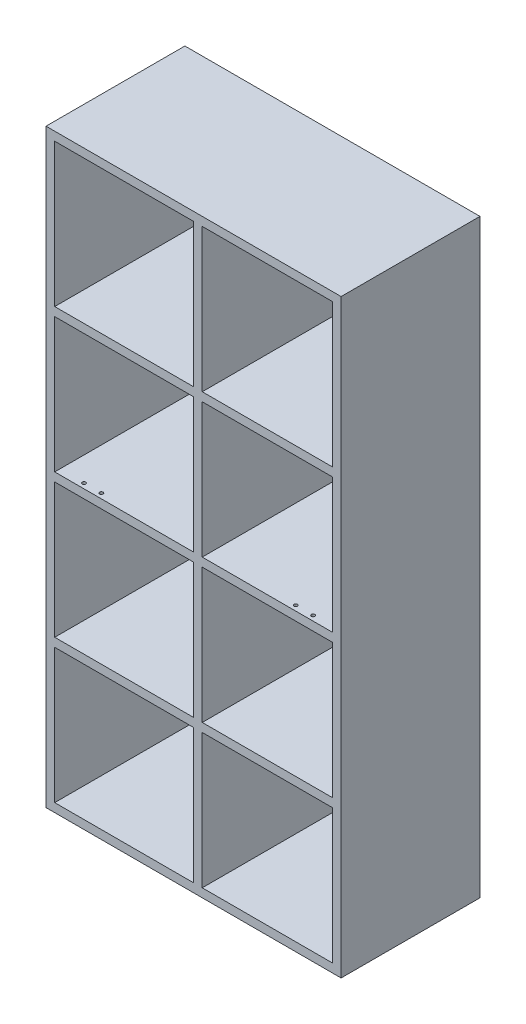
ISO-10303-21;
HEADER;
FILE_DESCRIPTION(('STEP AP214'),'2;1');
FILE_NAME('part.step','',(''),(''),'','','');
FILE_SCHEMA(('AUTOMOTIVE_DESIGN { 1 0 10303 214 1 1 1 1 }'));
ENDSEC;
DATA;
#1=APPLICATION_CONTEXT('core data for automotive mechanical design processes');
#2=APPLICATION_PROTOCOL_DEFINITION('international standard','automotive_design',2000,#1);
#3=PRODUCT_CONTEXT('',#1,'mechanical');
#4=PRODUCT('Part','Part','',(#3));
#5=PRODUCT_RELATED_PRODUCT_CATEGORY('part','',(#4));
#6=PRODUCT_DEFINITION_FORMATION('','',#4);
#7=PRODUCT_DEFINITION_CONTEXT('part definition',#1,'design');
#8=PRODUCT_DEFINITION('design','',#6,#7);
#9=PRODUCT_DEFINITION_SHAPE('','',#8);
#10=(LENGTH_UNIT() NAMED_UNIT(*) SI_UNIT(.MILLI.,.METRE.));
#11=(NAMED_UNIT(*) PLANE_ANGLE_UNIT() SI_UNIT($,.RADIAN.));
#12=(NAMED_UNIT(*) SI_UNIT($,.STERADIAN.) SOLID_ANGLE_UNIT());
#13=UNCERTAINTY_MEASURE_WITH_UNIT(LENGTH_MEASURE(1.E-05),#10,'distance_accuracy_value','');
#14=(GEOMETRIC_REPRESENTATION_CONTEXT(3) GLOBAL_UNCERTAINTY_ASSIGNED_CONTEXT((#13)) GLOBAL_UNIT_ASSIGNED_CONTEXT((#10,
#11,#12)) REPRESENTATION_CONTEXT('',''));
#15=CARTESIAN_POINT('',(0.,0.,0.));
#16=DIRECTION('',(0.,0.,1.));
#17=DIRECTION('',(1.,0.,0.));
#18=AXIS2_PLACEMENT_3D('',#15,#16,#17);
#19=CARTESIAN_POINT('',(-4.32070815681838E-12,1237.5,400.));
#20=DIRECTION('',(0.,1.,0.));
#21=DIRECTION('',(0.,0.,1.));
#22=AXIS2_PLACEMENT_3D('',#19,#20,#21);
#23=PLANE('',#22);
#24=DIRECTION('',(0.,0.,1.));
#25=VECTOR('',#24,1.);
#26=CARTESIAN_POINT('',(399.999999999996,1237.5,400.));
#27=LINE('',#26,#25);
#28=CARTESIAN_POINT('',(399.999999999996,1237.5,0.));
#29=VERTEX_POINT('',#28);
#30=CARTESIAN_POINT('',(399.999999999996,1237.5,400.));
#31=VERTEX_POINT('',#30);
#32=EDGE_CURVE('E416',#29,#31,#27,.T.);
#33=ORIENTED_EDGE('',*,*,#32,.F.);
#34=DIRECTION('',(1.,0.,0.));
#35=VECTOR('',#34,1.);
#36=CARTESIAN_POINT('',(-4.32070815681838E-12,1237.5,0.));
#37=LINE('',#36,#35);
#38=CARTESIAN_POINT('',(-4.32070815681838E-12,1237.5,0.));
#39=VERTEX_POINT('',#38);
#40=EDGE_CURVE('E456',#39,#29,#37,.T.);
#41=ORIENTED_EDGE('',*,*,#40,.F.);
#42=DIRECTION('',(0.,0.,-1.));
#43=VECTOR('',#42,1.);
#44=CARTESIAN_POINT('',(-4.32070815681838E-12,1237.5,400.));
#45=LINE('',#44,#43);
#46=CARTESIAN_POINT('',(-4.32070815681838E-12,1237.5,400.));
#47=VERTEX_POINT('',#46);
#48=EDGE_CURVE('E467',#47,#39,#45,.T.);
#49=ORIENTED_EDGE('',*,*,#48,.F.);
#50=DIRECTION('',(1.,0.,0.));
#51=VECTOR('',#50,1.);
#52=CARTESIAN_POINT('',(-4.32070815681838E-12,1237.5,400.));
#53=LINE('',#52,#51);
#54=EDGE_CURVE('E333',#47,#31,#53,.T.);
#55=ORIENTED_EDGE('',*,*,#54,.T.);
#56=EDGE_LOOP('',(#33,#41,#49,#55));
#57=FACE_BOUND('',#56,.T.);
#58=ADVANCED_FACE('F128',(#57),#23,.T.);
#59=CARTESIAN_POINT('',(-4.32070815681838E-12,1212.5,400.));
#60=DIRECTION('',(0.,1.,0.));
#61=DIRECTION('',(0.,0.,1.));
#62=AXIS2_PLACEMENT_3D('',#59,#60,#61);
#63=PLANE('',#62);
#64=DIRECTION('',(1.,0.,0.));
#65=VECTOR('',#64,1.);
#66=CARTESIAN_POINT('',(-4.32070815681838E-12,1212.5,0.));
#67=LINE('',#66,#65);
#68=CARTESIAN_POINT('',(-4.32070815681838E-12,1212.5,0.));
#69=VERTEX_POINT('',#68);
#70=CARTESIAN_POINT('',(399.999999999996,1212.5,0.));
#71=VERTEX_POINT('',#70);
#72=EDGE_CURVE('E433',#69,#71,#67,.T.);
#73=ORIENTED_EDGE('',*,*,#72,.T.);
#74=DIRECTION('',(0.,0.,1.));
#75=VECTOR('',#74,1.);
#76=CARTESIAN_POINT('',(399.999999999996,1212.5,400.));
#77=LINE('',#76,#75);
#78=CARTESIAN_POINT('',(399.999999999996,1212.5,400.));
#79=VERTEX_POINT('',#78);
#80=EDGE_CURVE('E137',#71,#79,#77,.T.);
#81=ORIENTED_EDGE('',*,*,#80,.T.);
#82=DIRECTION('',(1.,0.,0.));
#83=VECTOR('',#82,1.);
#84=CARTESIAN_POINT('',(-4.32070815681838E-12,1212.5,400.));
#85=LINE('',#84,#83);
#86=CARTESIAN_POINT('',(-4.32070815681838E-12,1212.5,400.));
#87=VERTEX_POINT('',#86);
#88=EDGE_CURVE('E430',#87,#79,#85,.T.);
#89=ORIENTED_EDGE('',*,*,#88,.F.);
#90=DIRECTION('',(0.,0.,-1.));
#91=VECTOR('',#90,1.);
#92=CARTESIAN_POINT('',(-4.32070815681838E-12,1212.5,400.));
#93=LINE('',#92,#91);
#94=EDGE_CURVE('E461',#87,#69,#93,.T.);
#95=ORIENTED_EDGE('',*,*,#94,.T.);
#96=EDGE_LOOP('',(#73,#81,#89,#95));
#97=FACE_BOUND('',#96,.T.);
#98=ADVANCED_FACE('F426',(#97),#63,.F.);
#99=CARTESIAN_POINT('',(0.,0.,0.));
#100=DIRECTION('',(0.,0.,-1.));
#101=DIRECTION('',(-1.,0.,0.));
#102=AXIS2_PLACEMENT_3D('',#99,#100,#101);
#103=PLANE('',#102);
#104=DIRECTION('',(0.,1.,0.));
#105=VECTOR('',#104,1.);
#106=CARTESIAN_POINT('',(800.,0.,0.));
#107=LINE('',#106,#105);
#108=CARTESIAN_POINT('',(800.,0.,0.));
#109=VERTEX_POINT('',#108);
#110=CARTESIAN_POINT('',(799.999999999999,387.5,0.));
#111=VERTEX_POINT('',#110);
#112=EDGE_CURVE('E562',#109,#111,#107,.T.);
#113=ORIENTED_EDGE('',*,*,#112,.T.);
#114=DIRECTION('',(1.,0.,0.));
#115=VECTOR('',#114,1.);
#116=CARTESIAN_POINT('',(-1.44023605227279E-12,387.5,0.));
#117=LINE('',#116,#115);
#118=CARTESIAN_POINT('',(424.999999999999,387.5,0.));
#119=VERTEX_POINT('',#118);
#120=EDGE_CURVE('E397',#119,#111,#117,.T.);
#121=ORIENTED_EDGE('',*,*,#120,.F.);
#122=DIRECTION('',(0.,1.,0.));
#123=VECTOR('',#122,1.);
#124=CARTESIAN_POINT('',(425.,0.,0.));
#125=LINE('',#124,#123);
#126=CARTESIAN_POINT('',(425.,0.,0.));
#127=VERTEX_POINT('',#126);
#128=EDGE_CURVE('E482',#127,#119,#125,.T.);
#129=ORIENTED_EDGE('',*,*,#128,.F.);
#130=DIRECTION('',(1.,0.,0.));
#131=VECTOR('',#130,1.);
#132=CARTESIAN_POINT('',(0.,0.,0.));
#133=LINE('',#132,#131);
#134=EDGE_CURVE('E561',#127,#109,#133,.T.);
#135=ORIENTED_EDGE('',*,*,#134,.T.);
#136=EDGE_LOOP('',(#113,#121,#129,#135));
#137=FACE_BOUND('',#136,.T.);
#138=DIRECTION('',(0.,1.,0.));
#139=VECTOR('',#138,1.);
#140=CARTESIAN_POINT('',(0.,0.,0.));
#141=LINE('',#140,#139);
#142=CARTESIAN_POINT('',(-1.44023605227279E-12,412.5,0.));
#143=VERTEX_POINT('',#142);
#144=CARTESIAN_POINT('',(-2.88047210454559E-12,800.,0.));
#145=VERTEX_POINT('',#144);
#146=EDGE_CURVE('E570',#143,#145,#141,.T.);
#147=ORIENTED_EDGE('',*,*,#146,.F.);
#148=DIRECTION('',(1.,0.,0.));
#149=VECTOR('',#148,1.);
#150=CARTESIAN_POINT('',(-1.44023605227279E-12,412.5,0.));
#151=LINE('',#150,#149);
#152=CARTESIAN_POINT('',(399.999999999999,412.5,0.));
#153=VERTEX_POINT('',#152);
#154=EDGE_CURVE('E536',#143,#153,#151,.T.);
#155=ORIENTED_EDGE('',*,*,#154,.T.);
#156=DIRECTION('',(0.,1.,0.));
#157=VECTOR('',#156,1.);
#158=CARTESIAN_POINT('',(400.,0.,0.));
#159=LINE('',#158,#157);
#160=CARTESIAN_POINT('',(399.999999999997,800.,0.));
#161=VERTEX_POINT('',#160);
#162=EDGE_CURVE('E491',#153,#161,#159,.T.);
#163=ORIENTED_EDGE('',*,*,#162,.T.);
#164=DIRECTION('',(1.,0.,0.));
#165=VECTOR('',#164,1.);
#166=CARTESIAN_POINT('',(-2.88047210454559E-12,800.,0.));
#167=LINE('',#166,#165);
#168=EDGE_CURVE('E506',#145,#161,#167,.T.);
#169=ORIENTED_EDGE('',*,*,#168,.F.);
#170=EDGE_LOOP('',(#147,#155,#163,#169));
#171=FACE_BOUND('',#170,.T.);
#172=CARTESIAN_POINT('',(799.999999999999,412.5,0.));
#173=VERTEX_POINT('',#172);
#174=CARTESIAN_POINT('',(799.999999999997,800.,0.));
#175=VERTEX_POINT('',#174);
#176=EDGE_CURVE('E566',#173,#175,#107,.T.);
#177=ORIENTED_EDGE('',*,*,#176,.T.);
#178=CARTESIAN_POINT('',(424.999999999997,800.,0.));
#179=VERTEX_POINT('',#178);
#180=EDGE_CURVE('E510',#179,#175,#167,.T.);
#181=ORIENTED_EDGE('',*,*,#180,.F.);
#182=CARTESIAN_POINT('',(424.999999999999,412.5,0.));
#183=VERTEX_POINT('',#182);
#184=EDGE_CURVE('E486',#183,#179,#125,.T.);
#185=ORIENTED_EDGE('',*,*,#184,.F.);
#186=EDGE_CURVE('E535',#183,#173,#151,.T.);
#187=ORIENTED_EDGE('',*,*,#186,.T.);
#188=EDGE_LOOP('',(#177,#181,#185,#187));
#189=FACE_BOUND('',#188,.T.);
#190=CARTESIAN_POINT('',(-2.88047210454559E-12,825.,0.));
#191=VERTEX_POINT('',#190);
#192=EDGE_CURVE('E575',#191,#69,#141,.T.);
#193=ORIENTED_EDGE('',*,*,#192,.F.);
#194=DIRECTION('',(1.,0.,0.));
#195=VECTOR('',#194,1.);
#196=CARTESIAN_POINT('',(-2.88047210454559E-12,825.,0.));
#197=LINE('',#196,#195);
#198=CARTESIAN_POINT('',(399.999999999997,825.,0.));
#199=VERTEX_POINT('',#198);
#200=EDGE_CURVE('E511',#191,#199,#197,.T.);
#201=ORIENTED_EDGE('',*,*,#200,.T.);
#202=EDGE_CURVE('E589',#199,#71,#159,.T.);
#203=ORIENTED_EDGE('',*,*,#202,.T.);
#204=ORIENTED_EDGE('',*,*,#72,.F.);
#205=EDGE_LOOP('',(#193,#201,#203,#204));
#206=FACE_BOUND('',#205,.T.);
#207=DIRECTION('',(1.,0.,0.));
#208=VECTOR('',#207,1.);
#209=CARTESIAN_POINT('',(-5.76094420909117E-12,1650.,0.));
#210=LINE('',#209,#208);
#211=CARTESIAN_POINT('',(424.999999999994,1650.,0.));
#212=VERTEX_POINT('',#211);
#213=CARTESIAN_POINT('',(799.999999999994,1650.,0.));
#214=VERTEX_POINT('',#213);
#215=EDGE_CURVE('E565',#212,#214,#210,.T.);
#216=ORIENTED_EDGE('',*,*,#215,.F.);
#217=CARTESIAN_POINT('',(424.999999999996,1237.5,0.));
#218=VERTEX_POINT('',#217);
#219=EDGE_CURVE('E487',#218,#212,#125,.T.);
#220=ORIENTED_EDGE('',*,*,#219,.F.);
#221=CARTESIAN_POINT('',(799.999999999996,1237.5,0.));
#222=VERTEX_POINT('',#221);
#223=EDGE_CURVE('E463',#218,#222,#37,.T.);
#224=ORIENTED_EDGE('',*,*,#223,.T.);
#225=EDGE_CURVE('E560',#222,#214,#107,.T.);
#226=ORIENTED_EDGE('',*,*,#225,.T.);
#227=EDGE_LOOP('',(#216,#220,#224,#226));
#228=FACE_BOUND('',#227,.T.);
#229=CARTESIAN_POINT('',(0.,0.,0.));
#230=VERTEX_POINT('',#229);
#231=CARTESIAN_POINT('',(400.,0.,0.));
#232=VERTEX_POINT('',#231);
#233=EDGE_CURVE('E318',#230,#232,#133,.T.);
#234=ORIENTED_EDGE('',*,*,#233,.T.);
#235=CARTESIAN_POINT('',(399.999999999999,387.5,0.));
#236=VERTEX_POINT('',#235);
#237=EDGE_CURVE('E488',#232,#236,#159,.T.);
#238=ORIENTED_EDGE('',*,*,#237,.T.);
#239=CARTESIAN_POINT('',(-1.44023605227279E-12,387.5,0.));
#240=VERTEX_POINT('',#239);
#241=EDGE_CURVE('E532',#240,#236,#117,.T.);
#242=ORIENTED_EDGE('',*,*,#241,.F.);
#243=EDGE_CURVE('E568',#230,#240,#141,.T.);
#244=ORIENTED_EDGE('',*,*,#243,.F.);
#245=EDGE_LOOP('',(#234,#238,#242,#244));
#246=FACE_BOUND('',#245,.T.);
#247=CARTESIAN_POINT('',(799.999999999997,825.,0.));
#248=VERTEX_POINT('',#247);
#249=CARTESIAN_POINT('',(799.999999999996,1212.5,0.));
#250=VERTEX_POINT('',#249);
#251=EDGE_CURVE('E657',#248,#250,#107,.T.);
#252=ORIENTED_EDGE('',*,*,#251,.T.);
#253=CARTESIAN_POINT('',(424.999999999996,1212.5,0.));
#254=VERTEX_POINT('',#253);
#255=EDGE_CURVE('E415',#254,#250,#67,.T.);
#256=ORIENTED_EDGE('',*,*,#255,.F.);
#257=CARTESIAN_POINT('',(424.999999999997,825.,0.));
#258=VERTEX_POINT('',#257);
#259=EDGE_CURVE('E620',#258,#254,#125,.T.);
#260=ORIENTED_EDGE('',*,*,#259,.F.);
#261=EDGE_CURVE('E509',#258,#248,#197,.T.);
#262=ORIENTED_EDGE('',*,*,#261,.T.);
#263=EDGE_LOOP('',(#252,#256,#260,#262));
#264=FACE_BOUND('',#263,.T.);
#265=ORIENTED_EDGE('',*,*,#40,.T.);
#266=CARTESIAN_POINT('',(399.999999999994,1650.,0.));
#267=VERTEX_POINT('',#266);
#268=EDGE_CURVE('E485',#29,#267,#159,.T.);
#269=ORIENTED_EDGE('',*,*,#268,.T.);
#270=CARTESIAN_POINT('',(-5.76094420909117E-12,1650.,0.));
#271=VERTEX_POINT('',#270);
#272=EDGE_CURVE('E567',#271,#267,#210,.T.);
#273=ORIENTED_EDGE('',*,*,#272,.F.);
#274=EDGE_CURVE('E353',#39,#271,#141,.T.);
#275=ORIENTED_EDGE('',*,*,#274,.F.);
#276=EDGE_LOOP('',(#265,#269,#273,#275));
#277=FACE_BOUND('',#276,.T.);
#278=DIRECTION('',(1.,0.,0.));
#279=VECTOR('',#278,1.);
#280=CARTESIAN_POINT('',(0.,-25.,0.));
#281=LINE('',#280,#279);
#282=CARTESIAN_POINT('',(-24.9999999999999,-25.,0.));
#283=VERTEX_POINT('',#282);
#284=CARTESIAN_POINT('',(825.,-25.,0.));
#285=VERTEX_POINT('',#284);
#286=EDGE_CURVE('E365',#283,#285,#281,.T.);
#287=ORIENTED_EDGE('',*,*,#286,.F.);
#288=DIRECTION('',(0.,1.,0.));
#289=VECTOR('',#288,1.);
#290=CARTESIAN_POINT('',(-25.,0.,0.));
#291=LINE('',#290,#289);
#292=CARTESIAN_POINT('',(-25.0000000000059,1675.,0.));
#293=VERTEX_POINT('',#292);
#294=EDGE_CURVE('E370',#283,#293,#291,.T.);
#295=ORIENTED_EDGE('',*,*,#294,.T.);
#296=DIRECTION('',(1.,0.,0.));
#297=VECTOR('',#296,1.);
#298=CARTESIAN_POINT('',(-5.76094420909117E-12,1675.,0.));
#299=LINE('',#298,#297);
#300=CARTESIAN_POINT('',(824.999999999994,1675.,0.));
#301=VERTEX_POINT('',#300);
#302=EDGE_CURVE('E384',#293,#301,#299,.T.);
#303=ORIENTED_EDGE('',*,*,#302,.T.);
#304=DIRECTION('',(0.,1.,0.));
#305=VECTOR('',#304,1.);
#306=CARTESIAN_POINT('',(825.,0.,0.));
#307=LINE('',#306,#305);
#308=EDGE_CURVE('E381',#285,#301,#307,.T.);
#309=ORIENTED_EDGE('',*,*,#308,.F.);
#310=EDGE_LOOP('',(#287,#295,#303,#309));
#311=FACE_BOUND('',#310,.T.);
#312=ADVANCED_FACE('F587',(#137,#171,#189,#206,#228,#246,#264,#277,#311),#103,.T.);
#313=CARTESIAN_POINT('',(0.,0.,400.));
#314=DIRECTION('',(0.,0.,-1.));
#315=DIRECTION('',(-1.,0.,0.));
#316=AXIS2_PLACEMENT_3D('',#313,#314,#315);
#317=PLANE('',#316);
#318=DIRECTION('',(1.,0.,0.));
#319=VECTOR('',#318,1.);
#320=CARTESIAN_POINT('',(-1.44023605227279E-12,387.5,400.));
#321=LINE('',#320,#319);
#322=CARTESIAN_POINT('',(424.999999999999,387.5,400.));
#323=VERTEX_POINT('',#322);
#324=CARTESIAN_POINT('',(799.999999999999,387.5,400.));
#325=VERTEX_POINT('',#324);
#326=EDGE_CURVE('E527',#323,#325,#321,.T.);
#327=ORIENTED_EDGE('',*,*,#326,.T.);
#328=DIRECTION('',(0.,1.,0.));
#329=VECTOR('',#328,1.);
#330=CARTESIAN_POINT('',(800.,0.,400.));
#331=LINE('',#330,#329);
#332=CARTESIAN_POINT('',(800.,0.,400.));
#333=VERTEX_POINT('',#332);
#334=EDGE_CURVE('E553',#333,#325,#331,.T.);
#335=ORIENTED_EDGE('',*,*,#334,.F.);
#336=DIRECTION('',(1.,0.,0.));
#337=VECTOR('',#336,1.);
#338=CARTESIAN_POINT('',(0.,0.,400.));
#339=LINE('',#338,#337);
#340=CARTESIAN_POINT('',(425.,0.,400.));
#341=VERTEX_POINT('',#340);
#342=EDGE_CURVE('E552',#341,#333,#339,.T.);
#343=ORIENTED_EDGE('',*,*,#342,.F.);
#344=DIRECTION('',(0.,1.,0.));
#345=VECTOR('',#344,1.);
#346=CARTESIAN_POINT('',(425.,0.,400.));
#347=LINE('',#346,#345);
#348=EDGE_CURVE('E474',#341,#323,#347,.T.);
#349=ORIENTED_EDGE('',*,*,#348,.T.);
#350=EDGE_LOOP('',(#327,#335,#343,#349));
#351=FACE_BOUND('',#350,.T.);
#352=DIRECTION('',(1.,0.,0.));
#353=VECTOR('',#352,1.);
#354=CARTESIAN_POINT('',(-1.44023605227279E-12,412.5,400.));
#355=LINE('',#354,#353);
#356=CARTESIAN_POINT('',(-1.44023605227279E-12,412.5,400.));
#357=VERTEX_POINT('',#356);
#358=CARTESIAN_POINT('',(399.999999999999,412.5,400.));
#359=VERTEX_POINT('',#358);
#360=EDGE_CURVE('E528',#357,#359,#355,.T.);
#361=ORIENTED_EDGE('',*,*,#360,.F.);
#362=DIRECTION('',(0.,1.,0.));
#363=VECTOR('',#362,1.);
#364=CARTESIAN_POINT('',(0.,0.,400.));
#365=LINE('',#364,#363);
#366=CARTESIAN_POINT('',(-2.88047210454559E-12,800.,400.));
#367=VERTEX_POINT('',#366);
#368=EDGE_CURVE('E558',#357,#367,#365,.T.);
#369=ORIENTED_EDGE('',*,*,#368,.T.);
#370=DIRECTION('',(1.,0.,0.));
#371=VECTOR('',#370,1.);
#372=CARTESIAN_POINT('',(-2.88047210454559E-12,800.,400.));
#373=LINE('',#372,#371);
#374=CARTESIAN_POINT('',(399.999999999997,800.,400.));
#375=VERTEX_POINT('',#374);
#376=EDGE_CURVE('E498',#367,#375,#373,.T.);
#377=ORIENTED_EDGE('',*,*,#376,.T.);
#378=DIRECTION('',(0.,1.,0.));
#379=VECTOR('',#378,1.);
#380=CARTESIAN_POINT('',(400.,0.,400.));
#381=LINE('',#380,#379);
#382=EDGE_CURVE('E445',#359,#375,#381,.T.);
#383=ORIENTED_EDGE('',*,*,#382,.F.);
#384=EDGE_LOOP('',(#361,#369,#377,#383));
#385=FACE_BOUND('',#384,.T.);
#386=CARTESIAN_POINT('',(424.999999999997,800.,400.));
#387=VERTEX_POINT('',#386);
#388=CARTESIAN_POINT('',(799.999999999997,800.,400.));
#389=VERTEX_POINT('',#388);
#390=EDGE_CURVE('E502',#387,#389,#373,.T.);
#391=ORIENTED_EDGE('',*,*,#390,.T.);
#392=CARTESIAN_POINT('',(799.999999999999,412.5,400.));
#393=VERTEX_POINT('',#392);
#394=EDGE_CURVE('E555',#393,#389,#331,.T.);
#395=ORIENTED_EDGE('',*,*,#394,.F.);
#396=CARTESIAN_POINT('',(424.999999999999,412.5,400.));
#397=VERTEX_POINT('',#396);
#398=EDGE_CURVE('E526',#397,#393,#355,.T.);
#399=ORIENTED_EDGE('',*,*,#398,.F.);
#400=EDGE_CURVE('E476',#397,#387,#347,.T.);
#401=ORIENTED_EDGE('',*,*,#400,.T.);
#402=EDGE_LOOP('',(#391,#395,#399,#401));
#403=FACE_BOUND('',#402,.T.);
#404=DIRECTION('',(1.,0.,0.));
#405=VECTOR('',#404,1.);
#406=CARTESIAN_POINT('',(-2.88047210454559E-12,825.,400.));
#407=LINE('',#406,#405);
#408=CARTESIAN_POINT('',(-2.88047210454559E-12,825.,400.));
#409=VERTEX_POINT('',#408);
#410=CARTESIAN_POINT('',(399.999999999997,825.,400.));
#411=VERTEX_POINT('',#410);
#412=EDGE_CURVE('E503',#409,#411,#407,.T.);
#413=ORIENTED_EDGE('',*,*,#412,.F.);
#414=EDGE_CURVE('E337',#409,#87,#365,.T.);
#415=ORIENTED_EDGE('',*,*,#414,.T.);
#416=ORIENTED_EDGE('',*,*,#88,.T.);
#417=EDGE_CURVE('E440',#411,#79,#381,.T.);
#418=ORIENTED_EDGE('',*,*,#417,.F.);
#419=EDGE_LOOP('',(#413,#415,#416,#418));
#420=FACE_BOUND('',#419,.T.);
#421=CARTESIAN_POINT('',(424.999999999996,1237.5,400.));
#422=VERTEX_POINT('',#421);
#423=CARTESIAN_POINT('',(424.999999999994,1650.,400.));
#424=VERTEX_POINT('',#423);
#425=EDGE_CURVE('E477',#422,#424,#347,.T.);
#426=ORIENTED_EDGE('',*,*,#425,.T.);
#427=DIRECTION('',(1.,0.,0.));
#428=VECTOR('',#427,1.);
#429=CARTESIAN_POINT('',(-5.76094420909117E-12,1650.,400.));
#430=LINE('',#429,#428);
#431=CARTESIAN_POINT('',(799.999999999994,1650.,400.));
#432=VERTEX_POINT('',#431);
#433=EDGE_CURVE('E349',#424,#432,#430,.T.);
#434=ORIENTED_EDGE('',*,*,#433,.T.);
#435=CARTESIAN_POINT('',(799.999999999996,1237.5,400.));
#436=VERTEX_POINT('',#435);
#437=EDGE_CURVE('E551',#436,#432,#331,.T.);
#438=ORIENTED_EDGE('',*,*,#437,.F.);
#439=EDGE_CURVE('E451',#422,#436,#53,.T.);
#440=ORIENTED_EDGE('',*,*,#439,.F.);
#441=EDGE_LOOP('',(#426,#434,#438,#440));
#442=FACE_BOUND('',#441,.T.);
#443=CARTESIAN_POINT('',(400.,0.,400.));
#444=VERTEX_POINT('',#443);
#445=CARTESIAN_POINT('',(399.999999999999,387.5,400.));
#446=VERTEX_POINT('',#445);
#447=EDGE_CURVE('E478',#444,#446,#381,.T.);
#448=ORIENTED_EDGE('',*,*,#447,.F.);
#449=CARTESIAN_POINT('',(0.,0.,400.));
#450=VERTEX_POINT('',#449);
#451=EDGE_CURVE('E548',#450,#444,#339,.T.);
#452=ORIENTED_EDGE('',*,*,#451,.F.);
#453=CARTESIAN_POINT('',(-1.44023605227279E-12,387.5,400.));
#454=VERTEX_POINT('',#453);
#455=EDGE_CURVE('E339',#450,#454,#365,.T.);
#456=ORIENTED_EDGE('',*,*,#455,.T.);
#457=EDGE_CURVE('E523',#454,#446,#321,.T.);
#458=ORIENTED_EDGE('',*,*,#457,.T.);
#459=EDGE_LOOP('',(#448,#452,#456,#458));
#460=FACE_BOUND('',#459,.T.);
#461=CARTESIAN_POINT('',(424.999999999996,1212.5,400.));
#462=VERTEX_POINT('',#461);
#463=CARTESIAN_POINT('',(799.999999999996,1212.5,400.));
#464=VERTEX_POINT('',#463);
#465=EDGE_CURVE('E452',#462,#464,#85,.T.);
#466=ORIENTED_EDGE('',*,*,#465,.T.);
#467=CARTESIAN_POINT('',(799.999999999997,825.,400.));
#468=VERTEX_POINT('',#467);
#469=EDGE_CURVE('E636',#468,#464,#331,.T.);
#470=ORIENTED_EDGE('',*,*,#469,.F.);
#471=CARTESIAN_POINT('',(424.999999999997,825.,400.));
#472=VERTEX_POINT('',#471);
#473=EDGE_CURVE('E501',#472,#468,#407,.T.);
#474=ORIENTED_EDGE('',*,*,#473,.F.);
#475=EDGE_CURVE('E618',#472,#462,#347,.T.);
#476=ORIENTED_EDGE('',*,*,#475,.T.);
#477=EDGE_LOOP('',(#466,#470,#474,#476));
#478=FACE_BOUND('',#477,.T.);
#479=CARTESIAN_POINT('',(-5.76094420909117E-12,1650.,400.));
#480=VERTEX_POINT('',#479);
#481=CARTESIAN_POINT('',(399.999999999994,1650.,400.));
#482=VERTEX_POINT('',#481);
#483=EDGE_CURVE('E330',#480,#482,#430,.T.);
#484=ORIENTED_EDGE('',*,*,#483,.T.);
#485=EDGE_CURVE('E446',#31,#482,#381,.T.);
#486=ORIENTED_EDGE('',*,*,#485,.F.);
#487=ORIENTED_EDGE('',*,*,#54,.F.);
#488=EDGE_CURVE('E325',#47,#480,#365,.T.);
#489=ORIENTED_EDGE('',*,*,#488,.T.);
#490=EDGE_LOOP('',(#484,#486,#487,#489));
#491=FACE_BOUND('',#490,.T.);
#492=DIRECTION('',(1.,0.,0.));
#493=VECTOR('',#492,1.);
#494=CARTESIAN_POINT('',(0.,-25.,400.));
#495=LINE('',#494,#493);
#496=CARTESIAN_POINT('',(-24.9999999999999,-25.,400.));
#497=VERTEX_POINT('',#496);
#498=CARTESIAN_POINT('',(825.,-25.,400.));
#499=VERTEX_POINT('',#498);
#500=EDGE_CURVE('E366',#497,#499,#495,.T.);
#501=ORIENTED_EDGE('',*,*,#500,.T.);
#502=DIRECTION('',(0.,1.,0.));
#503=VECTOR('',#502,1.);
#504=CARTESIAN_POINT('',(825.,0.,400.));
#505=LINE('',#504,#503);
#506=CARTESIAN_POINT('',(824.999999999994,1675.,400.));
#507=VERTEX_POINT('',#506);
#508=EDGE_CURVE('E369',#499,#507,#505,.T.);
#509=ORIENTED_EDGE('',*,*,#508,.T.);
#510=DIRECTION('',(1.,0.,0.));
#511=VECTOR('',#510,1.);
#512=CARTESIAN_POINT('',(-5.76094420909117E-12,1675.,400.));
#513=LINE('',#512,#511);
#514=CARTESIAN_POINT('',(-25.0000000000059,1675.,400.));
#515=VERTEX_POINT('',#514);
#516=EDGE_CURVE('E372',#515,#507,#513,.T.);
#517=ORIENTED_EDGE('',*,*,#516,.F.);
#518=DIRECTION('',(0.,1.,0.));
#519=VECTOR('',#518,1.);
#520=CARTESIAN_POINT('',(-25.,0.,400.));
#521=LINE('',#520,#519);
#522=EDGE_CURVE('E375',#497,#515,#521,.T.);
#523=ORIENTED_EDGE('',*,*,#522,.F.);
#524=EDGE_LOOP('',(#501,#509,#517,#523));
#525=FACE_BOUND('',#524,.T.);
#526=ADVANCED_FACE('F327',(#351,#385,#403,#420,#442,#460,#478,#491,#525),#317,.F.);
#527=ORIENTED_EDGE('',*,*,#223,.F.);
#528=DIRECTION('',(0.,0.,1.));
#529=VECTOR('',#528,1.);
#530=CARTESIAN_POINT('',(424.999999999996,1237.5,400.));
#531=LINE('',#530,#529);
#532=EDGE_CURVE('E145',#218,#422,#531,.T.);
#533=ORIENTED_EDGE('',*,*,#532,.T.);
#534=ORIENTED_EDGE('',*,*,#439,.T.);
#535=DIRECTION('',(0.,0.,-1.));
#536=VECTOR('',#535,1.);
#537=CARTESIAN_POINT('',(799.999999999996,1237.5,400.));
#538=LINE('',#537,#536);
#539=EDGE_CURVE('E469',#436,#222,#538,.T.);
#540=ORIENTED_EDGE('',*,*,#539,.T.);
#541=EDGE_LOOP('',(#527,#533,#534,#540));
#542=FACE_BOUND('',#541,.T.);
#543=ADVANCED_FACE('F680',(#542),#23,.T.);
#544=DIRECTION('',(0.,0.,1.));
#545=VECTOR('',#544,1.);
#546=CARTESIAN_POINT('',(424.999999999996,1212.5,400.));
#547=LINE('',#546,#545);
#548=EDGE_CURVE('E12',#254,#462,#547,.T.);
#549=ORIENTED_EDGE('',*,*,#548,.F.);
#550=ORIENTED_EDGE('',*,*,#255,.T.);
#551=DIRECTION('',(0.,0.,-1.));
#552=VECTOR('',#551,1.);
#553=CARTESIAN_POINT('',(799.999999999996,1212.5,400.));
#554=LINE('',#553,#552);
#555=EDGE_CURVE('E418',#464,#250,#554,.T.);
#556=ORIENTED_EDGE('',*,*,#555,.F.);
#557=ORIENTED_EDGE('',*,*,#465,.F.);
#558=EDGE_LOOP('',(#549,#550,#556,#557));
#559=FACE_BOUND('',#558,.T.);
#560=ADVANCED_FACE('F629',(#559),#63,.F.);
#561=CARTESIAN_POINT('',(400.,0.,400.));
#562=DIRECTION('',(-1.,0.,0.));
#563=DIRECTION('',(0.,-1.,0.));
#564=AXIS2_PLACEMENT_3D('',#561,#562,#563);
#565=PLANE('',#564);
#566=ORIENTED_EDGE('',*,*,#382,.T.);
#567=DIRECTION('',(0.,0.,-1.));
#568=VECTOR('',#567,1.);
#569=CARTESIAN_POINT('',(399.999999999997,800.,400.));
#570=LINE('',#569,#568);
#571=EDGE_CURVE('E407',#375,#161,#570,.T.);
#572=ORIENTED_EDGE('',*,*,#571,.T.);
#573=ORIENTED_EDGE('',*,*,#162,.F.);
#574=DIRECTION('',(0.,0.,-1.));
#575=VECTOR('',#574,1.);
#576=CARTESIAN_POINT('',(399.999999999999,412.5,400.));
#577=LINE('',#576,#575);
#578=EDGE_CURVE('E398',#359,#153,#577,.T.);
#579=ORIENTED_EDGE('',*,*,#578,.F.);
#580=EDGE_LOOP('',(#566,#572,#573,#579));
#581=FACE_BOUND('',#580,.T.);
#582=ADVANCED_FACE('F689',(#581),#565,.T.);
#583=CARTESIAN_POINT('',(425.,0.,400.));
#584=DIRECTION('',(-1.,0.,0.));
#585=DIRECTION('',(0.,-1.,0.));
#586=AXIS2_PLACEMENT_3D('',#583,#584,#585);
#587=PLANE('',#586);
#588=DIRECTION('',(0.,0.,-1.));
#589=VECTOR('',#588,1.);
#590=CARTESIAN_POINT('',(424.999999999997,800.,400.));
#591=LINE('',#590,#589);
#592=EDGE_CURVE('E409',#387,#179,#591,.T.);
#593=ORIENTED_EDGE('',*,*,#592,.F.);
#594=ORIENTED_EDGE('',*,*,#400,.F.);
#595=DIRECTION('',(0.,0.,-1.));
#596=VECTOR('',#595,1.);
#597=CARTESIAN_POINT('',(424.999999999999,412.5,400.));
#598=LINE('',#597,#596);
#599=EDGE_CURVE('E402',#397,#183,#598,.T.);
#600=ORIENTED_EDGE('',*,*,#599,.T.);
#601=ORIENTED_EDGE('',*,*,#184,.T.);
#602=EDGE_LOOP('',(#593,#594,#600,#601));
#603=FACE_BOUND('',#602,.T.);
#604=ADVANCED_FACE('F677',(#603),#587,.F.);
#605=CARTESIAN_POINT('',(-1.44023605227279E-12,387.5,400.));
#606=DIRECTION('',(0.,1.,0.));
#607=DIRECTION('',(0.,0.,1.));
#608=AXIS2_PLACEMENT_3D('',#605,#606,#607);
#609=PLANE('',#608);
#610=DIRECTION('',(0.,0.,-1.));
#611=VECTOR('',#610,1.);
#612=CARTESIAN_POINT('',(399.999999999999,387.5,400.));
#613=LINE('',#612,#611);
#614=EDGE_CURVE('E400',#446,#236,#613,.T.);
#615=ORIENTED_EDGE('',*,*,#614,.F.);
#616=ORIENTED_EDGE('',*,*,#457,.F.);
#617=DIRECTION('',(0.,0.,-1.));
#618=VECTOR('',#617,1.);
#619=CARTESIAN_POINT('',(-1.44023605227279E-12,387.5,400.));
#620=LINE('',#619,#618);
#621=EDGE_CURVE('E531',#454,#240,#620,.T.);
#622=ORIENTED_EDGE('',*,*,#621,.T.);
#623=ORIENTED_EDGE('',*,*,#241,.T.);
#624=EDGE_LOOP('',(#615,#616,#622,#623));
#625=FACE_BOUND('',#624,.T.);
#626=ADVANCED_FACE('F736',(#625),#609,.F.);
#627=CARTESIAN_POINT('',(-1.44023605227279E-12,412.5,400.));
#628=DIRECTION('',(0.,1.,0.));
#629=DIRECTION('',(0.,0.,1.));
#630=AXIS2_PLACEMENT_3D('',#627,#628,#629);
#631=PLANE('',#630);
#632=ORIENTED_EDGE('',*,*,#360,.T.);
#633=ORIENTED_EDGE('',*,*,#578,.T.);
#634=ORIENTED_EDGE('',*,*,#154,.F.);
#635=DIRECTION('',(0.,0.,-1.));
#636=VECTOR('',#635,1.);
#637=CARTESIAN_POINT('',(-1.44023605227279E-12,412.5,400.));
#638=LINE('',#637,#636);
#639=EDGE_CURVE('E540',#357,#143,#638,.T.);
#640=ORIENTED_EDGE('',*,*,#639,.F.);
#641=EDGE_LOOP('',(#632,#633,#634,#640));
#642=FACE_BOUND('',#641,.T.);
#643=ADVANCED_FACE('F829',(#642),#631,.T.);
#644=CARTESIAN_POINT('',(-2.88047210454559E-12,800.,400.));
#645=DIRECTION('',(0.,1.,0.));
#646=DIRECTION('',(0.,0.,1.));
#647=AXIS2_PLACEMENT_3D('',#644,#645,#646);
#648=PLANE('',#647);
#649=CARTESIAN_POINT('',(70.0000000000001,800.,385.65));
#650=DIRECTION('',(0.,1.,0.));
#651=DIRECTION('',(0.,0.,1.));
#652=AXIS2_PLACEMENT_3D('',#649,#650,#651);
#653=CIRCLE('',#652,5.00000000000001);
#654=CARTESIAN_POINT('',(70.0000000000001,800.,390.65));
#655=VERTEX_POINT('',#654);
#656=EDGE_CURVE('E798',#655,#655,#653,.T.);
#657=ORIENTED_EDGE('',*,*,#656,.T.);
#658=EDGE_LOOP('',(#657));
#659=FACE_BOUND('',#658,.T.);
#660=CARTESIAN_POINT('',(120.,800.,385.65));
#661=DIRECTION('',(0.,1.,0.));
#662=DIRECTION('',(0.,0.,1.));
#663=AXIS2_PLACEMENT_3D('',#660,#661,#662);
#664=CIRCLE('',#663,4.99999999999999);
#665=CARTESIAN_POINT('',(120.,800.,390.65));
#666=VERTEX_POINT('',#665);
#667=EDGE_CURVE('E803',#666,#666,#664,.T.);
#668=ORIENTED_EDGE('',*,*,#667,.T.);
#669=EDGE_LOOP('',(#668));
#670=FACE_BOUND('',#669,.T.);
#671=ORIENTED_EDGE('',*,*,#571,.F.);
#672=ORIENTED_EDGE('',*,*,#376,.F.);
#673=DIRECTION('',(0.,0.,-1.));
#674=VECTOR('',#673,1.);
#675=CARTESIAN_POINT('',(-2.88047210454559E-12,800.,400.));
#676=LINE('',#675,#674);
#677=EDGE_CURVE('E505',#367,#145,#676,.T.);
#678=ORIENTED_EDGE('',*,*,#677,.T.);
#679=ORIENTED_EDGE('',*,*,#168,.T.);
#680=EDGE_LOOP('',(#671,#672,#678,#679));
#681=FACE_BOUND('',#680,.T.);
#682=ADVANCED_FACE('F824',(#659,#670,#681),#648,.F.);
#683=CARTESIAN_POINT('',(729.999999999997,800.,385.65));
#684=DIRECTION('',(0.,1.,0.));
#685=DIRECTION('',(0.,0.,1.));
#686=AXIS2_PLACEMENT_3D('',#683,#684,#685);
#687=CIRCLE('',#686,5.00000000000005);
#688=CARTESIAN_POINT('',(729.999999999997,800.,390.65));
#689=VERTEX_POINT('',#688);
#690=EDGE_CURVE('E790',#689,#689,#687,.T.);
#691=ORIENTED_EDGE('',*,*,#690,.T.);
#692=EDGE_LOOP('',(#691));
#693=FACE_BOUND('',#692,.T.);
#694=CARTESIAN_POINT('',(679.999999999997,800.,385.65));
#695=DIRECTION('',(0.,1.,0.));
#696=DIRECTION('',(0.,0.,1.));
#697=AXIS2_PLACEMENT_3D('',#694,#695,#696);
#698=CIRCLE('',#697,5.00000000000005);
#699=CARTESIAN_POINT('',(679.999999999997,800.,390.65));
#700=VERTEX_POINT('',#699);
#701=EDGE_CURVE('E779',#700,#700,#698,.T.);
#702=ORIENTED_EDGE('',*,*,#701,.T.);
#703=EDGE_LOOP('',(#702));
#704=FACE_BOUND('',#703,.T.);
#705=ORIENTED_EDGE('',*,*,#390,.F.);
#706=ORIENTED_EDGE('',*,*,#592,.T.);
#707=ORIENTED_EDGE('',*,*,#180,.T.);
#708=DIRECTION('',(0.,0.,-1.));
#709=VECTOR('',#708,1.);
#710=CARTESIAN_POINT('',(799.999999999997,800.,400.));
#711=LINE('',#710,#709);
#712=EDGE_CURVE('E520',#389,#175,#711,.T.);
#713=ORIENTED_EDGE('',*,*,#712,.F.);
#714=EDGE_LOOP('',(#705,#706,#707,#713));
#715=FACE_BOUND('',#714,.T.);
#716=ADVANCED_FACE('F673',(#693,#704,#715),#648,.F.);
#717=ORIENTED_EDGE('',*,*,#599,.F.);
#718=ORIENTED_EDGE('',*,*,#398,.T.);
#719=DIRECTION('',(0.,0.,-1.));
#720=VECTOR('',#719,1.);
#721=CARTESIAN_POINT('',(799.999999999999,412.5,400.));
#722=LINE('',#721,#720);
#723=EDGE_CURVE('E542',#393,#173,#722,.T.);
#724=ORIENTED_EDGE('',*,*,#723,.T.);
#725=ORIENTED_EDGE('',*,*,#186,.F.);
#726=EDGE_LOOP('',(#717,#718,#724,#725));
#727=FACE_BOUND('',#726,.T.);
#728=ADVANCED_FACE('F929',(#727),#631,.T.);
#729=ORIENTED_EDGE('',*,*,#326,.F.);
#730=DIRECTION('',(0.,0.,-1.));
#731=VECTOR('',#730,1.);
#732=CARTESIAN_POINT('',(424.999999999999,387.5,400.));
#733=LINE('',#732,#731);
#734=EDGE_CURVE('E404',#323,#119,#733,.T.);
#735=ORIENTED_EDGE('',*,*,#734,.T.);
#736=ORIENTED_EDGE('',*,*,#120,.T.);
#737=DIRECTION('',(0.,0.,-1.));
#738=VECTOR('',#737,1.);
#739=CARTESIAN_POINT('',(799.999999999999,387.5,400.));
#740=LINE('',#739,#738);
#741=EDGE_CURVE('E545',#325,#111,#740,.T.);
#742=ORIENTED_EDGE('',*,*,#741,.F.);
#743=EDGE_LOOP('',(#729,#735,#736,#742));
#744=FACE_BOUND('',#743,.T.);
#745=ADVANCED_FACE('F728',(#744),#609,.F.);
#746=ORIENTED_EDGE('',*,*,#734,.F.);
#747=ORIENTED_EDGE('',*,*,#348,.F.);
#748=DIRECTION('',(0.,0.,-1.));
#749=VECTOR('',#748,1.);
#750=CARTESIAN_POINT('',(425.,0.,400.));
#751=LINE('',#750,#749);
#752=EDGE_CURVE('E481',#341,#127,#751,.T.);
#753=ORIENTED_EDGE('',*,*,#752,.T.);
#754=ORIENTED_EDGE('',*,*,#128,.T.);
#755=EDGE_LOOP('',(#746,#747,#753,#754));
#756=FACE_BOUND('',#755,.T.);
#757=ADVANCED_FACE('F718',(#756),#587,.F.);
#758=ORIENTED_EDGE('',*,*,#447,.T.);
#759=ORIENTED_EDGE('',*,*,#614,.T.);
#760=ORIENTED_EDGE('',*,*,#237,.F.);
#761=DIRECTION('',(0.,0.,-1.));
#762=VECTOR('',#761,1.);
#763=CARTESIAN_POINT('',(400.,0.,400.));
#764=LINE('',#763,#762);
#765=EDGE_CURVE('E493',#444,#232,#764,.T.);
#766=ORIENTED_EDGE('',*,*,#765,.F.);
#767=EDGE_LOOP('',(#758,#759,#760,#766));
#768=FACE_BOUND('',#767,.T.);
#769=ADVANCED_FACE('F708',(#768),#565,.T.);
#770=CARTESIAN_POINT('',(-2.88047210454559E-12,825.,400.));
#771=DIRECTION('',(0.,1.,0.));
#772=DIRECTION('',(0.,0.,1.));
#773=AXIS2_PLACEMENT_3D('',#770,#771,#772);
#774=PLANE('',#773);
#775=CARTESIAN_POINT('',(729.999999999997,825.,385.65));
#776=DIRECTION('',(0.,1.,0.));
#777=DIRECTION('',(0.,0.,1.));
#778=AXIS2_PLACEMENT_3D('',#775,#776,#777);
#779=CIRCLE('',#778,5.00000000000005);
#780=CARTESIAN_POINT('',(729.999999999997,825.,390.65));
#781=VERTEX_POINT('',#780);
#782=EDGE_CURVE('E793',#781,#781,#779,.T.);
#783=ORIENTED_EDGE('',*,*,#782,.F.);
#784=EDGE_LOOP('',(#783));
#785=FACE_BOUND('',#784,.T.);
#786=CARTESIAN_POINT('',(679.999999999997,825.,385.65));
#787=DIRECTION('',(0.,1.,0.));
#788=DIRECTION('',(0.,0.,1.));
#789=AXIS2_PLACEMENT_3D('',#786,#787,#788);
#790=CIRCLE('',#789,5.00000000000005);
#791=CARTESIAN_POINT('',(679.999999999997,825.,390.65));
#792=VERTEX_POINT('',#791);
#793=EDGE_CURVE('E775',#792,#792,#790,.T.);
#794=ORIENTED_EDGE('',*,*,#793,.F.);
#795=EDGE_LOOP('',(#794));
#796=FACE_BOUND('',#795,.T.);
#797=DIRECTION('',(0.,0.,-1.));
#798=VECTOR('',#797,1.);
#799=CARTESIAN_POINT('',(424.999999999997,825.,400.));
#800=LINE('',#799,#798);
#801=EDGE_CURVE('E412',#472,#258,#800,.T.);
#802=ORIENTED_EDGE('',*,*,#801,.F.);
#803=ORIENTED_EDGE('',*,*,#473,.T.);
#804=DIRECTION('',(0.,0.,-1.));
#805=VECTOR('',#804,1.);
#806=CARTESIAN_POINT('',(799.999999999997,825.,400.));
#807=LINE('',#806,#805);
#808=EDGE_CURVE('E517',#468,#248,#807,.T.);
#809=ORIENTED_EDGE('',*,*,#808,.T.);
#810=ORIENTED_EDGE('',*,*,#261,.F.);
#811=EDGE_LOOP('',(#802,#803,#809,#810));
#812=FACE_BOUND('',#811,.T.);
#813=ADVANCED_FACE('F720',(#785,#796,#812),#774,.T.);
#814=CARTESIAN_POINT('',(70.0000000000001,825.,385.65));
#815=DIRECTION('',(0.,1.,0.));
#816=DIRECTION('',(0.,0.,1.));
#817=AXIS2_PLACEMENT_3D('',#814,#815,#816);
#818=CIRCLE('',#817,5.00000000000001);
#819=CARTESIAN_POINT('',(70.0000000000001,825.,390.65));
#820=VERTEX_POINT('',#819);
#821=EDGE_CURVE('E801',#820,#820,#818,.T.);
#822=ORIENTED_EDGE('',*,*,#821,.F.);
#823=EDGE_LOOP('',(#822));
#824=FACE_BOUND('',#823,.T.);
#825=CARTESIAN_POINT('',(120.,825.,385.65));
#826=DIRECTION('',(0.,1.,0.));
#827=DIRECTION('',(0.,0.,1.));
#828=AXIS2_PLACEMENT_3D('',#825,#826,#827);
#829=CIRCLE('',#828,4.99999999999999);
#830=CARTESIAN_POINT('',(120.,825.,390.65));
#831=VERTEX_POINT('',#830);
#832=EDGE_CURVE('E458',#831,#831,#829,.T.);
#833=ORIENTED_EDGE('',*,*,#832,.F.);
#834=EDGE_LOOP('',(#833));
#835=FACE_BOUND('',#834,.T.);
#836=ORIENTED_EDGE('',*,*,#412,.T.);
#837=DIRECTION('',(0.,0.,-1.));
#838=VECTOR('',#837,1.);
#839=CARTESIAN_POINT('',(399.999999999997,825.,400.));
#840=LINE('',#839,#838);
#841=EDGE_CURVE('E405',#411,#199,#840,.T.);
#842=ORIENTED_EDGE('',*,*,#841,.T.);
#843=ORIENTED_EDGE('',*,*,#200,.F.);
#844=DIRECTION('',(0.,0.,-1.));
#845=VECTOR('',#844,1.);
#846=CARTESIAN_POINT('',(-2.88047210454559E-12,825.,400.));
#847=LINE('',#846,#845);
#848=EDGE_CURVE('E515',#409,#191,#847,.T.);
#849=ORIENTED_EDGE('',*,*,#848,.F.);
#850=EDGE_LOOP('',(#836,#842,#843,#849));
#851=FACE_BOUND('',#850,.T.);
#852=ADVANCED_FACE('F717',(#824,#835,#851),#774,.T.);
#853=ORIENTED_EDGE('',*,*,#532,.F.);
#854=ORIENTED_EDGE('',*,*,#219,.T.);
#855=DIRECTION('',(0.,0.,-1.));
#856=VECTOR('',#855,1.);
#857=CARTESIAN_POINT('',(424.999999999994,1650.,400.));
#858=LINE('',#857,#856);
#859=EDGE_CURVE('E401',#424,#212,#858,.T.);
#860=ORIENTED_EDGE('',*,*,#859,.F.);
#861=ORIENTED_EDGE('',*,*,#425,.F.);
#862=EDGE_LOOP('',(#853,#854,#860,#861));
#863=FACE_BOUND('',#862,.T.);
#864=ADVANCED_FACE('F679',(#863),#587,.F.);
#865=ORIENTED_EDGE('',*,*,#268,.F.);
#866=ORIENTED_EDGE('',*,*,#32,.T.);
#867=ORIENTED_EDGE('',*,*,#485,.T.);
#868=DIRECTION('',(0.,0.,-1.));
#869=VECTOR('',#868,1.);
#870=CARTESIAN_POINT('',(399.999999999994,1650.,400.));
#871=LINE('',#870,#869);
#872=EDGE_CURVE('E348',#482,#267,#871,.T.);
#873=ORIENTED_EDGE('',*,*,#872,.T.);
#874=EDGE_LOOP('',(#865,#866,#867,#873));
#875=FACE_BOUND('',#874,.T.);
#876=ADVANCED_FACE('F599',(#875),#565,.T.);
#877=CARTESIAN_POINT('',(0.,0.,400.));
#878=DIRECTION('',(-1.,0.,0.));
#879=DIRECTION('',(0.,-1.,0.));
#880=AXIS2_PLACEMENT_3D('',#877,#878,#879);
#881=PLANE('',#880);
#882=ORIENTED_EDGE('',*,*,#243,.T.);
#883=ORIENTED_EDGE('',*,*,#621,.F.);
#884=ORIENTED_EDGE('',*,*,#455,.F.);
#885=DIRECTION('',(0.,0.,-1.));
#886=VECTOR('',#885,1.);
#887=CARTESIAN_POINT('',(0.,0.,400.));
#888=LINE('',#887,#886);
#889=EDGE_CURVE('E355',#450,#230,#888,.T.);
#890=ORIENTED_EDGE('',*,*,#889,.T.);
#891=EDGE_LOOP('',(#882,#883,#884,#890));
#892=FACE_BOUND('',#891,.T.);
#893=ADVANCED_FACE('F710',(#892),#881,.F.);
#894=ORIENTED_EDGE('',*,*,#677,.F.);
#895=ORIENTED_EDGE('',*,*,#368,.F.);
#896=ORIENTED_EDGE('',*,*,#639,.T.);
#897=ORIENTED_EDGE('',*,*,#146,.T.);
#898=EDGE_LOOP('',(#894,#895,#896,#897));
#899=FACE_BOUND('',#898,.T.);
#900=ADVANCED_FACE('F715',(#899),#881,.F.);
#901=ORIENTED_EDGE('',*,*,#94,.F.);
#902=ORIENTED_EDGE('',*,*,#414,.F.);
#903=ORIENTED_EDGE('',*,*,#848,.T.);
#904=ORIENTED_EDGE('',*,*,#192,.T.);
#905=EDGE_LOOP('',(#901,#902,#903,#904));
#906=FACE_BOUND('',#905,.T.);
#907=ADVANCED_FACE('F581',(#906),#881,.F.);
#908=ORIENTED_EDGE('',*,*,#488,.F.);
#909=ORIENTED_EDGE('',*,*,#48,.T.);
#910=ORIENTED_EDGE('',*,*,#274,.T.);
#911=DIRECTION('',(0.,0.,-1.));
#912=VECTOR('',#911,1.);
#913=CARTESIAN_POINT('',(-5.76094420909117E-12,1650.,400.));
#914=LINE('',#913,#912);
#915=EDGE_CURVE('E345',#480,#271,#914,.T.);
#916=ORIENTED_EDGE('',*,*,#915,.F.);
#917=EDGE_LOOP('',(#908,#909,#910,#916));
#918=FACE_BOUND('',#917,.T.);
#919=ADVANCED_FACE('F351',(#918),#881,.F.);
#920=CARTESIAN_POINT('',(-5.76094420909117E-12,1650.,400.));
#921=DIRECTION('',(0.,1.,0.));
#922=DIRECTION('',(0.,0.,1.));
#923=AXIS2_PLACEMENT_3D('',#920,#921,#922);
#924=PLANE('',#923);
#925=ORIENTED_EDGE('',*,*,#872,.F.);
#926=ORIENTED_EDGE('',*,*,#483,.F.);
#927=ORIENTED_EDGE('',*,*,#915,.T.);
#928=ORIENTED_EDGE('',*,*,#272,.T.);
#929=EDGE_LOOP('',(#925,#926,#927,#928));
#930=FACE_BOUND('',#929,.T.);
#931=ADVANCED_FACE('F343',(#930),#924,.F.);
#932=ORIENTED_EDGE('',*,*,#433,.F.);
#933=ORIENTED_EDGE('',*,*,#859,.T.);
#934=ORIENTED_EDGE('',*,*,#215,.T.);
#935=DIRECTION('',(0.,0.,-1.));
#936=VECTOR('',#935,1.);
#937=CARTESIAN_POINT('',(799.999999999994,1650.,400.));
#938=LINE('',#937,#936);
#939=EDGE_CURVE('E354',#432,#214,#938,.T.);
#940=ORIENTED_EDGE('',*,*,#939,.F.);
#941=EDGE_LOOP('',(#932,#933,#934,#940));
#942=FACE_BOUND('',#941,.T.);
#943=ADVANCED_FACE('F652',(#942),#924,.F.);
#944=CARTESIAN_POINT('',(800.,0.,400.));
#945=DIRECTION('',(-1.,0.,0.));
#946=DIRECTION('',(0.,-1.,0.));
#947=AXIS2_PLACEMENT_3D('',#944,#945,#946);
#948=PLANE('',#947);
#949=ORIENTED_EDGE('',*,*,#225,.F.);
#950=ORIENTED_EDGE('',*,*,#539,.F.);
#951=ORIENTED_EDGE('',*,*,#437,.T.);
#952=ORIENTED_EDGE('',*,*,#939,.T.);
#953=EDGE_LOOP('',(#949,#950,#951,#952));
#954=FACE_BOUND('',#953,.T.);
#955=ADVANCED_FACE('F644',(#954),#948,.T.);
#956=ORIENTED_EDGE('',*,*,#469,.T.);
#957=ORIENTED_EDGE('',*,*,#555,.T.);
#958=ORIENTED_EDGE('',*,*,#251,.F.);
#959=ORIENTED_EDGE('',*,*,#808,.F.);
#960=EDGE_LOOP('',(#956,#957,#958,#959));
#961=FACE_BOUND('',#960,.T.);
#962=ADVANCED_FACE('F637',(#961),#948,.T.);
#963=ORIENTED_EDGE('',*,*,#394,.T.);
#964=ORIENTED_EDGE('',*,*,#712,.T.);
#965=ORIENTED_EDGE('',*,*,#176,.F.);
#966=ORIENTED_EDGE('',*,*,#723,.F.);
#967=EDGE_LOOP('',(#963,#964,#965,#966));
#968=FACE_BOUND('',#967,.T.);
#969=ADVANCED_FACE('F668',(#968),#948,.T.);
#970=ORIENTED_EDGE('',*,*,#741,.T.);
#971=ORIENTED_EDGE('',*,*,#112,.F.);
#972=DIRECTION('',(0.,0.,-1.));
#973=VECTOR('',#972,1.);
#974=CARTESIAN_POINT('',(800.,0.,400.));
#975=LINE('',#974,#973);
#976=EDGE_CURVE('E358',#333,#109,#975,.T.);
#977=ORIENTED_EDGE('',*,*,#976,.F.);
#978=ORIENTED_EDGE('',*,*,#334,.T.);
#979=EDGE_LOOP('',(#970,#971,#977,#978));
#980=FACE_BOUND('',#979,.T.);
#981=ADVANCED_FACE('F847',(#980),#948,.T.);
#982=CARTESIAN_POINT('',(0.,0.,400.));
#983=DIRECTION('',(0.,1.,0.));
#984=DIRECTION('',(0.,0.,1.));
#985=AXIS2_PLACEMENT_3D('',#982,#983,#984);
#986=PLANE('',#985);
#987=ORIENTED_EDGE('',*,*,#752,.F.);
#988=ORIENTED_EDGE('',*,*,#342,.T.);
#989=ORIENTED_EDGE('',*,*,#976,.T.);
#990=ORIENTED_EDGE('',*,*,#134,.F.);
#991=EDGE_LOOP('',(#987,#988,#989,#990));
#992=FACE_BOUND('',#991,.T.);
#993=ADVANCED_FACE('F852',(#992),#986,.T.);
#994=ORIENTED_EDGE('',*,*,#451,.T.);
#995=ORIENTED_EDGE('',*,*,#765,.T.);
#996=ORIENTED_EDGE('',*,*,#233,.F.);
#997=ORIENTED_EDGE('',*,*,#889,.F.);
#998=EDGE_LOOP('',(#994,#995,#996,#997));
#999=FACE_BOUND('',#998,.T.);
#1000=ADVANCED_FACE('F848',(#999),#986,.T.);
#1001=CARTESIAN_POINT('',(825.,0.,400.));
#1002=DIRECTION('',(-1.,0.,0.));
#1003=DIRECTION('',(0.,-1.,0.));
#1004=AXIS2_PLACEMENT_3D('',#1001,#1002,#1003);
#1005=PLANE('',#1004);
#1006=ORIENTED_EDGE('',*,*,#308,.T.);
#1007=DIRECTION('',(0.,0.,-1.));
#1008=VECTOR('',#1007,1.);
#1009=CARTESIAN_POINT('',(824.999999999994,1675.,400.));
#1010=LINE('',#1009,#1008);
#1011=EDGE_CURVE('E392',#507,#301,#1010,.T.);
#1012=ORIENTED_EDGE('',*,*,#1011,.F.);
#1013=ORIENTED_EDGE('',*,*,#508,.F.);
#1014=DIRECTION('',(0.,0.,-1.));
#1015=VECTOR('',#1014,1.);
#1016=CARTESIAN_POINT('',(825.,-25.,400.));
#1017=LINE('',#1016,#1015);
#1018=EDGE_CURVE('E394',#499,#285,#1017,.T.);
#1019=ORIENTED_EDGE('',*,*,#1018,.T.);
#1020=EDGE_LOOP('',(#1006,#1012,#1013,#1019));
#1021=FACE_BOUND('',#1020,.T.);
#1022=ADVANCED_FACE('F851',(#1021),#1005,.F.);
#1023=CARTESIAN_POINT('',(-5.76094420909117E-12,1675.,400.));
#1024=DIRECTION('',(0.,1.,0.));
#1025=DIRECTION('',(0.,0.,1.));
#1026=AXIS2_PLACEMENT_3D('',#1023,#1024,#1025);
#1027=PLANE('',#1026);
#1028=ORIENTED_EDGE('',*,*,#302,.F.);
#1029=DIRECTION('',(0.,0.,-1.));
#1030=VECTOR('',#1029,1.);
#1031=CARTESIAN_POINT('',(-25.0000000000059,1675.,400.));
#1032=LINE('',#1031,#1030);
#1033=EDGE_CURVE('E390',#515,#293,#1032,.T.);
#1034=ORIENTED_EDGE('',*,*,#1033,.F.);
#1035=ORIENTED_EDGE('',*,*,#516,.T.);
#1036=ORIENTED_EDGE('',*,*,#1011,.T.);
#1037=EDGE_LOOP('',(#1028,#1034,#1035,#1036));
#1038=FACE_BOUND('',#1037,.T.);
#1039=ADVANCED_FACE('F856',(#1038),#1027,.T.);
#1040=CARTESIAN_POINT('',(-25.,0.,400.));
#1041=DIRECTION('',(-1.,0.,0.));
#1042=DIRECTION('',(0.,-1.,0.));
#1043=AXIS2_PLACEMENT_3D('',#1040,#1041,#1042);
#1044=PLANE('',#1043);
#1045=CARTESIAN_POINT('',(-25.0000000000058,1663.,152.811673975741));
#1046=DIRECTION('',(-1.,0.,0.));
#1047=DIRECTION('',(0.,-1.,0.));
#1048=AXIS2_PLACEMENT_3D('',#1045,#1046,#1047);
#1049=CIRCLE('',#1048,4.99999999999999);
#1050=CARTESIAN_POINT('',(-25.0000000000058,1658.,152.811673975741));
#1051=VERTEX_POINT('',#1050);
#1052=EDGE_CURVE('E776',#1051,#1051,#1049,.T.);
#1053=ORIENTED_EDGE('',*,*,#1052,.F.);
#1054=EDGE_LOOP('',(#1053));
#1055=FACE_BOUND('',#1054,.T.);
#1056=CARTESIAN_POINT('',(-25.0000000000058,1663.,72.0016739757406));
#1057=DIRECTION('',(-1.,0.,0.));
#1058=DIRECTION('',(0.,-1.,0.));
#1059=AXIS2_PLACEMENT_3D('',#1056,#1057,#1058);
#1060=CIRCLE('',#1059,5.00000000000001);
#1061=CARTESIAN_POINT('',(-25.0000000000058,1658.,72.0016739757406));
#1062=VERTEX_POINT('',#1061);
#1063=EDGE_CURVE('E787',#1062,#1062,#1060,.T.);
#1064=ORIENTED_EDGE('',*,*,#1063,.F.);
#1065=EDGE_LOOP('',(#1064));
#1066=FACE_BOUND('',#1065,.T.);
#1067=ORIENTED_EDGE('',*,*,#294,.F.);
#1068=DIRECTION('',(0.,0.,-1.));
#1069=VECTOR('',#1068,1.);
#1070=CARTESIAN_POINT('',(-24.9999999999999,-25.,400.));
#1071=LINE('',#1070,#1069);
#1072=EDGE_CURVE('E378',#497,#283,#1071,.T.);
#1073=ORIENTED_EDGE('',*,*,#1072,.F.);
#1074=ORIENTED_EDGE('',*,*,#522,.T.);
#1075=ORIENTED_EDGE('',*,*,#1033,.T.);
#1076=EDGE_LOOP('',(#1067,#1073,#1074,#1075));
#1077=FACE_BOUND('',#1076,.T.);
#1078=ADVANCED_FACE('F853',(#1055,#1066,#1077),#1044,.T.);
#1079=CARTESIAN_POINT('',(0.,-25.,400.));
#1080=DIRECTION('',(0.,1.,0.));
#1081=DIRECTION('',(0.,0.,1.));
#1082=AXIS2_PLACEMENT_3D('',#1079,#1080,#1081);
#1083=PLANE('',#1082);
#1084=ORIENTED_EDGE('',*,*,#286,.T.);
#1085=ORIENTED_EDGE('',*,*,#1018,.F.);
#1086=ORIENTED_EDGE('',*,*,#500,.F.);
#1087=ORIENTED_EDGE('',*,*,#1072,.T.);
#1088=EDGE_LOOP('',(#1084,#1085,#1086,#1087));
#1089=FACE_BOUND('',#1088,.T.);
#1090=ADVANCED_FACE('F130',(#1089),#1083,.F.);
#1091=ORIENTED_EDGE('',*,*,#259,.T.);
#1092=ORIENTED_EDGE('',*,*,#548,.T.);
#1093=ORIENTED_EDGE('',*,*,#475,.F.);
#1094=ORIENTED_EDGE('',*,*,#801,.T.);
#1095=EDGE_LOOP('',(#1091,#1092,#1093,#1094));
#1096=FACE_BOUND('',#1095,.T.);
#1097=ADVANCED_FACE('F617',(#1096),#587,.F.);
#1098=ORIENTED_EDGE('',*,*,#80,.F.);
#1099=ORIENTED_EDGE('',*,*,#202,.F.);
#1100=ORIENTED_EDGE('',*,*,#841,.F.);
#1101=ORIENTED_EDGE('',*,*,#417,.T.);
#1102=EDGE_LOOP('',(#1098,#1099,#1100,#1101));
#1103=FACE_BOUND('',#1102,.T.);
#1104=ADVANCED_FACE('F441',(#1103),#565,.T.);
#1105=CARTESIAN_POINT('',(120.,800.,385.65));
#1106=DIRECTION('',(0.,1.,0.));
#1107=DIRECTION('',(0.,0.,1.));
#1108=AXIS2_PLACEMENT_3D('',#1105,#1106,#1107);
#1109=CYLINDRICAL_SURFACE('',#1108,4.99999999999999);
#1110=ORIENTED_EDGE('',*,*,#667,.F.);
#1111=EDGE_LOOP('',(#1110));
#1112=FACE_BOUND('',#1111,.T.);
#1113=ORIENTED_EDGE('',*,*,#832,.T.);
#1114=EDGE_LOOP('',(#1113));
#1115=FACE_BOUND('',#1114,.T.);
#1116=ADVANCED_FACE('F691',(#1112,#1115),#1109,.F.);
#1117=CARTESIAN_POINT('',(70.0000000000001,800.,385.65));
#1118=DIRECTION('',(0.,1.,0.));
#1119=DIRECTION('',(0.,0.,1.));
#1120=AXIS2_PLACEMENT_3D('',#1117,#1118,#1119);
#1121=CYLINDRICAL_SURFACE('',#1120,5.00000000000001);
#1122=ORIENTED_EDGE('',*,*,#656,.F.);
#1123=EDGE_LOOP('',(#1122));
#1124=FACE_BOUND('',#1123,.T.);
#1125=ORIENTED_EDGE('',*,*,#821,.T.);
#1126=EDGE_LOOP('',(#1125));
#1127=FACE_BOUND('',#1126,.T.);
#1128=ADVANCED_FACE('F702',(#1124,#1127),#1121,.F.);
#1129=CARTESIAN_POINT('',(679.999999999997,800.,385.65));
#1130=DIRECTION('',(0.,1.,0.));
#1131=DIRECTION('',(0.,0.,1.));
#1132=AXIS2_PLACEMENT_3D('',#1129,#1130,#1131);
#1133=CYLINDRICAL_SURFACE('',#1132,5.00000000000005);
#1134=ORIENTED_EDGE('',*,*,#701,.F.);
#1135=EDGE_LOOP('',(#1134));
#1136=FACE_BOUND('',#1135,.T.);
#1137=ORIENTED_EDGE('',*,*,#793,.T.);
#1138=EDGE_LOOP('',(#1137));
#1139=FACE_BOUND('',#1138,.T.);
#1140=ADVANCED_FACE('F746',(#1136,#1139),#1133,.F.);
#1141=CARTESIAN_POINT('',(729.999999999997,800.,385.65));
#1142=DIRECTION('',(0.,1.,0.));
#1143=DIRECTION('',(0.,0.,1.));
#1144=AXIS2_PLACEMENT_3D('',#1141,#1142,#1143);
#1145=CYLINDRICAL_SURFACE('',#1144,5.00000000000005);
#1146=ORIENTED_EDGE('',*,*,#690,.F.);
#1147=EDGE_LOOP('',(#1146));
#1148=FACE_BOUND('',#1147,.T.);
#1149=ORIENTED_EDGE('',*,*,#782,.T.);
#1150=EDGE_LOOP('',(#1149));
#1151=FACE_BOUND('',#1150,.T.);
#1152=ADVANCED_FACE('F750',(#1148,#1151),#1145,.F.);
#1153=CARTESIAN_POINT('',(14.9999999999942,1663.,72.0016739757406));
#1154=DIRECTION('',(-1.,0.,0.));
#1155=DIRECTION('',(0.,-1.,0.));
#1156=AXIS2_PLACEMENT_3D('',#1153,#1154,#1155);
#1157=CYLINDRICAL_SURFACE('',#1156,5.00000000000001);
#1158=CARTESIAN_POINT('',(14.9999999999942,1663.,72.0016739757406));
#1159=DIRECTION('',(-1.,0.,0.));
#1160=DIRECTION('',(0.,-1.,0.));
#1161=AXIS2_PLACEMENT_3D('',#1158,#1159,#1160);
#1162=CIRCLE('',#1161,5.00000000000001);
#1163=CARTESIAN_POINT('',(14.9999999999942,1658.,72.0016739757406));
#1164=VERTEX_POINT('',#1163);
#1165=EDGE_CURVE('E782',#1164,#1164,#1162,.T.);
#1166=ORIENTED_EDGE('',*,*,#1165,.F.);
#1167=EDGE_LOOP('',(#1166));
#1168=FACE_BOUND('',#1167,.T.);
#1169=ORIENTED_EDGE('',*,*,#1063,.T.);
#1170=EDGE_LOOP('',(#1169));
#1171=FACE_BOUND('',#1170,.T.);
#1172=ADVANCED_FACE('F754',(#1168,#1171),#1157,.F.);
#1173=CARTESIAN_POINT('',(14.9999999999942,1663.,72.0016739757406));
#1174=DIRECTION('',(-1.,0.,0.));
#1175=DIRECTION('',(0.,-1.,0.));
#1176=AXIS2_PLACEMENT_3D('',#1173,#1174,#1175);
#1177=PLANE('',#1176);
#1178=ORIENTED_EDGE('',*,*,#1165,.T.);
#1179=EDGE_LOOP('',(#1178));
#1180=FACE_BOUND('',#1179,.T.);
#1181=ADVANCED_FACE('F758',(#1180),#1177,.T.);
#1182=CARTESIAN_POINT('',(14.9999999999942,1663.,152.811673975741));
#1183=DIRECTION('',(-1.,0.,0.));
#1184=DIRECTION('',(0.,-1.,0.));
#1185=AXIS2_PLACEMENT_3D('',#1182,#1183,#1184);
#1186=CYLINDRICAL_SURFACE('',#1185,4.99999999999999);
#1187=CARTESIAN_POINT('',(14.9999999999942,1663.,152.811673975741));
#1188=DIRECTION('',(-1.,0.,0.));
#1189=DIRECTION('',(0.,-1.,0.));
#1190=AXIS2_PLACEMENT_3D('',#1187,#1188,#1189);
#1191=CIRCLE('',#1190,4.99999999999999);
#1192=CARTESIAN_POINT('',(14.9999999999942,1658.,152.811673975741));
#1193=VERTEX_POINT('',#1192);
#1194=EDGE_CURVE('E774',#1193,#1193,#1191,.T.);
#1195=ORIENTED_EDGE('',*,*,#1194,.F.);
#1196=EDGE_LOOP('',(#1195));
#1197=FACE_BOUND('',#1196,.T.);
#1198=ORIENTED_EDGE('',*,*,#1052,.T.);
#1199=EDGE_LOOP('',(#1198));
#1200=FACE_BOUND('',#1199,.T.);
#1201=ADVANCED_FACE('F762',(#1197,#1200),#1186,.F.);
#1202=CARTESIAN_POINT('',(14.9999999999942,1663.,152.811673975741));
#1203=DIRECTION('',(-1.,0.,0.));
#1204=DIRECTION('',(0.,-1.,0.));
#1205=AXIS2_PLACEMENT_3D('',#1202,#1203,#1204);
#1206=PLANE('',#1205);
#1207=ORIENTED_EDGE('',*,*,#1194,.T.);
#1208=EDGE_LOOP('',(#1207));
#1209=FACE_BOUND('',#1208,.T.);
#1210=ADVANCED_FACE('F766',(#1209),#1206,.T.);
#1211=CLOSED_SHELL('',(#58,#98,#312,#526,#543,#560,#582,#604,#626,#643,#682,#716,#728,#745,#757,
#769,#813,#852,#864,#876,#893,#900,#907,#919,#931,#943,#955,#962,#969,#981,#993,#1000,#1022,
#1039,#1078,#1090,#1097,#1104,#1116,#1128,#1140,#1152,#1172,#1181,#1201,#1210));
#1212=MANIFOLD_SOLID_BREP('B2',#1211);
#1213=ADVANCED_BREP_SHAPE_REPRESENTATION('',(#18,#1212),#14);
#1214=SHAPE_DEFINITION_REPRESENTATION(#9,#1213);
ENDSEC;
END-ISO-10303-21;
